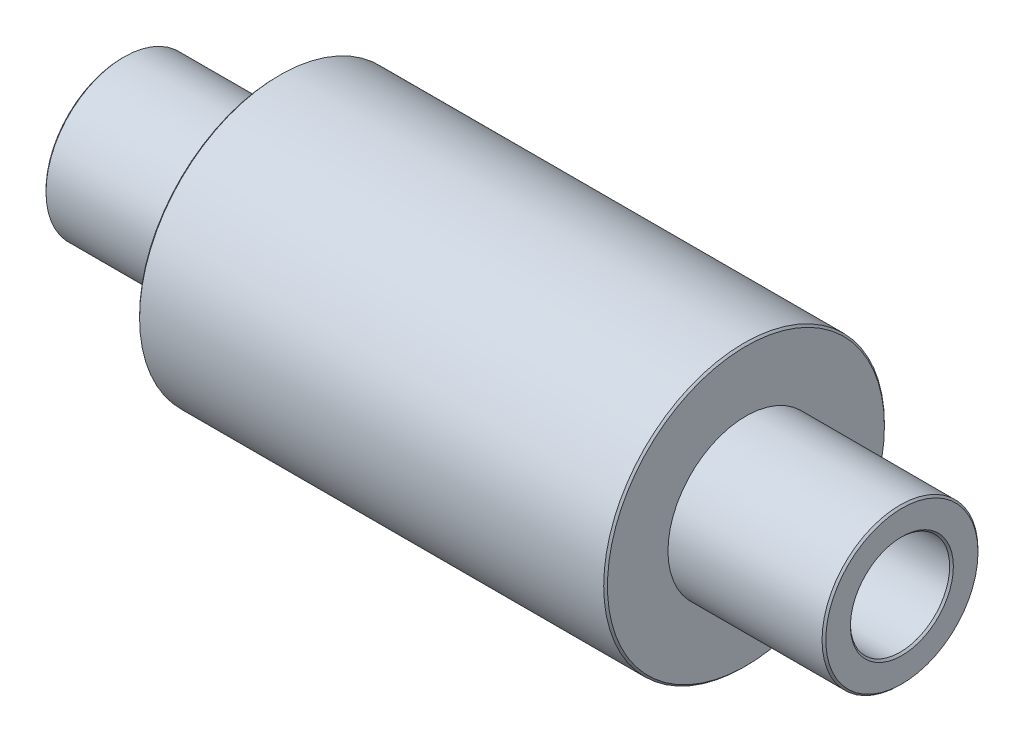
ISO-10303-21;
HEADER;
FILE_DESCRIPTION(('STEP AP214'),'2;1');
FILE_NAME('part.step','',(''),(''),'','','');
FILE_SCHEMA(('AUTOMOTIVE_DESIGN { 1 0 10303 214 1 1 1 1 }'));
ENDSEC;
DATA;
#1=APPLICATION_CONTEXT('core data for automotive mechanical design processes');
#2=APPLICATION_PROTOCOL_DEFINITION('international standard','automotive_design',2000,#1);
#3=PRODUCT_CONTEXT('',#1,'mechanical');
#4=PRODUCT('Part','Part','',(#3));
#5=PRODUCT_RELATED_PRODUCT_CATEGORY('part','',(#4));
#6=PRODUCT_DEFINITION_FORMATION('','',#4);
#7=PRODUCT_DEFINITION_CONTEXT('part definition',#1,'design');
#8=PRODUCT_DEFINITION('design','',#6,#7);
#9=PRODUCT_DEFINITION_SHAPE('','',#8);
#10=(LENGTH_UNIT() NAMED_UNIT(*) SI_UNIT(.MILLI.,.METRE.));
#11=(NAMED_UNIT(*) PLANE_ANGLE_UNIT() SI_UNIT($,.RADIAN.));
#12=(NAMED_UNIT(*) SI_UNIT($,.STERADIAN.) SOLID_ANGLE_UNIT());
#13=UNCERTAINTY_MEASURE_WITH_UNIT(LENGTH_MEASURE(1.E-05),#10,'distance_accuracy_value','');
#14=(GEOMETRIC_REPRESENTATION_CONTEXT(3) GLOBAL_UNCERTAINTY_ASSIGNED_CONTEXT((#13)) GLOBAL_UNIT_ASSIGNED_CONTEXT((#10,
#11,#12)) REPRESENTATION_CONTEXT('',''));
#15=CARTESIAN_POINT('',(0.,0.,0.));
#16=DIRECTION('',(0.,0.,1.));
#17=DIRECTION('',(1.,0.,0.));
#18=AXIS2_PLACEMENT_3D('',#15,#16,#17);
#19=CARTESIAN_POINT('',(15.875,0.,0.));
#20=DIRECTION('',(-1.,0.,0.));
#21=DIRECTION('',(0.,0.,1.));
#22=AXIS2_PLACEMENT_3D('',#19,#20,#21);
#23=CYLINDRICAL_SURFACE('',#22,5.715);
#24=CARTESIAN_POINT('',(-9.44880000000001,0.,0.));
#25=DIRECTION('',(-1.,0.,0.));
#26=DIRECTION('',(0.,0.,1.));
#27=AXIS2_PLACEMENT_3D('',#24,#25,#26);
#28=CIRCLE('',#27,5.715);
#29=CARTESIAN_POINT('',(-9.44880000000001,0.,5.715));
#30=VERTEX_POINT('',#29);
#31=EDGE_CURVE('E64',#30,#30,#28,.F.);
#32=ORIENTED_EDGE('',*,*,#31,.T.);
#33=EDGE_LOOP('',(#32));
#34=FACE_BOUND('',#33,.T.);
#35=CARTESIAN_POINT('',(9.4488,0.,0.));
#36=DIRECTION('',(1.,0.,0.));
#37=DIRECTION('',(0.,0.,-1.));
#38=AXIS2_PLACEMENT_3D('',#35,#36,#37);
#39=CIRCLE('',#38,5.715);
#40=CARTESIAN_POINT('',(9.4488,0.,-5.715));
#41=VERTEX_POINT('',#40);
#42=EDGE_CURVE('E79',#41,#41,#39,.F.);
#43=ORIENTED_EDGE('',*,*,#42,.T.);
#44=EDGE_LOOP('',(#43));
#45=FACE_BOUND('',#44,.T.);
#46=ADVANCED_FACE('F44',(#34,#45),#23,.T.);
#47=CARTESIAN_POINT('',(-15.875,0.,0.));
#48=DIRECTION('',(1.,0.,0.));
#49=DIRECTION('',(0.,0.,-1.));
#50=AXIS2_PLACEMENT_3D('',#47,#48,#49);
#51=PLANE('',#50);
#52=CARTESIAN_POINT('',(-15.875,0.,0.));
#53=DIRECTION('',(1.,0.,0.));
#54=DIRECTION('',(0.,0.,-1.));
#55=AXIS2_PLACEMENT_3D('',#52,#53,#54);
#56=CIRCLE('',#55,2.0955);
#57=CARTESIAN_POINT('',(-15.875,0.,-2.0955));
#58=VERTEX_POINT('',#57);
#59=EDGE_CURVE('E59',#58,#58,#56,.T.);
#60=ORIENTED_EDGE('',*,*,#59,.T.);
#61=EDGE_LOOP('',(#60));
#62=FACE_BOUND('',#61,.T.);
#63=CARTESIAN_POINT('',(-15.875,0.,0.));
#64=DIRECTION('',(1.,0.,0.));
#65=DIRECTION('',(0.,0.,-1.));
#66=AXIS2_PLACEMENT_3D('',#63,#64,#65);
#67=CIRCLE('',#66,3.0988);
#68=CARTESIAN_POINT('',(-15.875,0.,-3.0988));
#69=VERTEX_POINT('',#68);
#70=EDGE_CURVE('E73',#69,#69,#67,.F.);
#71=ORIENTED_EDGE('',*,*,#70,.T.);
#72=EDGE_LOOP('',(#71));
#73=FACE_BOUND('',#72,.T.);
#74=ADVANCED_FACE('F113',(#62,#73),#51,.F.);
#75=CARTESIAN_POINT('',(15.875,0.,0.));
#76=DIRECTION('',(1.,0.,0.));
#77=DIRECTION('',(0.,0.,-1.));
#78=AXIS2_PLACEMENT_3D('',#75,#76,#77);
#79=PLANE('',#78);
#80=CARTESIAN_POINT('',(15.875,0.,0.));
#81=DIRECTION('',(1.,0.,0.));
#82=DIRECTION('',(0.,0.,-1.));
#83=AXIS2_PLACEMENT_3D('',#80,#81,#82);
#84=CIRCLE('',#83,2.09549999999999);
#85=CARTESIAN_POINT('',(15.875,0.,-2.09549999999999));
#86=VERTEX_POINT('',#85);
#87=EDGE_CURVE('E12',#86,#86,#84,.F.);
#88=ORIENTED_EDGE('',*,*,#87,.T.);
#89=EDGE_LOOP('',(#88));
#90=FACE_BOUND('',#89,.T.);
#91=CARTESIAN_POINT('',(15.875,0.,0.));
#92=DIRECTION('',(1.,0.,0.));
#93=DIRECTION('',(0.,0.,-1.));
#94=AXIS2_PLACEMENT_3D('',#91,#92,#93);
#95=CIRCLE('',#94,3.0988);
#96=CARTESIAN_POINT('',(15.875,0.,-3.0988));
#97=VERTEX_POINT('',#96);
#98=EDGE_CURVE('E82',#97,#97,#95,.T.);
#99=ORIENTED_EDGE('',*,*,#98,.T.);
#100=EDGE_LOOP('',(#99));
#101=FACE_BOUND('',#100,.T.);
#102=ADVANCED_FACE('F119',(#90,#101),#79,.T.);
#103=CARTESIAN_POINT('',(15.875,0.,0.));
#104=DIRECTION('',(1.,0.,0.));
#105=DIRECTION('',(0.,0.,-1.));
#106=AXIS2_PLACEMENT_3D('',#103,#104,#105);
#107=CYLINDRICAL_SURFACE('',#106,2.01929999999999);
#108=CARTESIAN_POINT('',(-15.7988,0.,0.));
#109=DIRECTION('',(1.,0.,0.));
#110=DIRECTION('',(0.,0.,-1.));
#111=AXIS2_PLACEMENT_3D('',#108,#109,#110);
#112=CIRCLE('',#111,2.01929999999999);
#113=CARTESIAN_POINT('',(-15.7988,0.,-2.01929999999999));
#114=VERTEX_POINT('',#113);
#115=EDGE_CURVE('E51',#114,#114,#112,.F.);
#116=ORIENTED_EDGE('',*,*,#115,.T.);
#117=EDGE_LOOP('',(#116));
#118=FACE_BOUND('',#117,.T.);
#119=CARTESIAN_POINT('',(15.7988,0.,0.));
#120=DIRECTION('',(1.,0.,0.));
#121=DIRECTION('',(0.,0.,-1.));
#122=AXIS2_PLACEMENT_3D('',#119,#120,#121);
#123=CIRCLE('',#122,2.01929999999999);
#124=CARTESIAN_POINT('',(15.7988,0.,-2.01929999999999));
#125=VERTEX_POINT('',#124);
#126=EDGE_CURVE('E55',#125,#125,#123,.T.);
#127=ORIENTED_EDGE('',*,*,#126,.T.);
#128=EDGE_LOOP('',(#127));
#129=FACE_BOUND('',#128,.T.);
#130=ADVANCED_FACE('F152',(#118,#129),#107,.F.);
#131=CARTESIAN_POINT('',(0.,0.,0.));
#132=DIRECTION('',(-1.,0.,0.));
#133=DIRECTION('',(0.,0.,1.));
#134=AXIS2_PLACEMENT_3D('',#131,#132,#133);
#135=CYLINDRICAL_SURFACE('',#134,3.175);
#136=CARTESIAN_POINT('',(15.7988,0.,0.));
#137=DIRECTION('',(1.,0.,0.));
#138=DIRECTION('',(0.,0.,-1.));
#139=AXIS2_PLACEMENT_3D('',#136,#137,#138);
#140=CIRCLE('',#139,3.175);
#141=CARTESIAN_POINT('',(15.7988,0.,-3.175));
#142=VERTEX_POINT('',#141);
#143=EDGE_CURVE('E85',#142,#142,#140,.F.);
#144=ORIENTED_EDGE('',*,*,#143,.T.);
#145=EDGE_LOOP('',(#144));
#146=FACE_BOUND('',#145,.T.);
#147=CARTESIAN_POINT('',(9.525,0.,0.));
#148=DIRECTION('',(-1.,0.,0.));
#149=DIRECTION('',(0.,0.,1.));
#150=AXIS2_PLACEMENT_3D('',#147,#148,#149);
#151=CIRCLE('',#150,3.175);
#152=CARTESIAN_POINT('',(9.525,0.,3.175));
#153=VERTEX_POINT('',#152);
#154=EDGE_CURVE('E88',#153,#153,#151,.T.);
#155=ORIENTED_EDGE('',*,*,#154,.F.);
#156=EDGE_LOOP('',(#155));
#157=FACE_BOUND('',#156,.T.);
#158=ADVANCED_FACE('F154',(#146,#157),#135,.T.);
#159=CARTESIAN_POINT('',(9.525,5.715,0.));
#160=DIRECTION('',(1.,0.,0.));
#161=DIRECTION('',(0.,0.,-1.));
#162=AXIS2_PLACEMENT_3D('',#159,#160,#161);
#163=PLANE('',#162);
#164=CARTESIAN_POINT('',(9.525,0.,0.));
#165=DIRECTION('',(1.,0.,0.));
#166=DIRECTION('',(0.,0.,-1.));
#167=AXIS2_PLACEMENT_3D('',#164,#165,#166);
#168=CIRCLE('',#167,5.6388);
#169=CARTESIAN_POINT('',(9.525,0.,-5.6388));
#170=VERTEX_POINT('',#169);
#171=EDGE_CURVE('E76',#170,#170,#168,.T.);
#172=ORIENTED_EDGE('',*,*,#171,.T.);
#173=EDGE_LOOP('',(#172));
#174=FACE_BOUND('',#173,.T.);
#175=ORIENTED_EDGE('',*,*,#154,.T.);
#176=EDGE_LOOP('',(#175));
#177=FACE_BOUND('',#176,.T.);
#178=ADVANCED_FACE('F128',(#174,#177),#163,.T.);
#179=CARTESIAN_POINT('',(15.7988,0.,0.));
#180=DIRECTION('',(-1.,0.,0.));
#181=DIRECTION('',(0.,0.,1.));
#182=AXIS2_PLACEMENT_3D('',#179,#180,#181);
#183=CONICAL_SURFACE('',#182,3.175,0.785398163397443);
#184=ORIENTED_EDGE('',*,*,#98,.F.);
#185=EDGE_LOOP('',(#184));
#186=FACE_BOUND('',#185,.T.);
#187=ORIENTED_EDGE('',*,*,#143,.F.);
#188=EDGE_LOOP('',(#187));
#189=FACE_BOUND('',#188,.T.);
#190=ADVANCED_FACE('F125',(#186,#189),#183,.T.);
#191=CARTESIAN_POINT('',(9.4488,0.,0.));
#192=DIRECTION('',(-1.,0.,0.));
#193=DIRECTION('',(0.,0.,1.));
#194=AXIS2_PLACEMENT_3D('',#191,#192,#193);
#195=CONICAL_SURFACE('',#194,5.715,0.785398163397465);
#196=ORIENTED_EDGE('',*,*,#171,.F.);
#197=EDGE_LOOP('',(#196));
#198=FACE_BOUND('',#197,.T.);
#199=ORIENTED_EDGE('',*,*,#42,.F.);
#200=EDGE_LOOP('',(#199));
#201=FACE_BOUND('',#200,.T.);
#202=ADVANCED_FACE('F109',(#198,#201),#195,.T.);
#203=CARTESIAN_POINT('',(0.,0.,0.));
#204=DIRECTION('',(1.,0.,0.));
#205=DIRECTION('',(0.,0.,1.));
#206=AXIS2_PLACEMENT_3D('',#203,#204,#205);
#207=CYLINDRICAL_SURFACE('',#206,3.175);
#208=CARTESIAN_POINT('',(-15.7988,0.,0.));
#209=DIRECTION('',(1.,0.,0.));
#210=DIRECTION('',(0.,0.,-1.));
#211=AXIS2_PLACEMENT_3D('',#208,#209,#210);
#212=CIRCLE('',#211,3.175);
#213=CARTESIAN_POINT('',(-15.7988,0.,-3.175));
#214=VERTEX_POINT('',#213);
#215=EDGE_CURVE('E70',#214,#214,#212,.T.);
#216=ORIENTED_EDGE('',*,*,#215,.T.);
#217=EDGE_LOOP('',(#216));
#218=FACE_BOUND('',#217,.T.);
#219=CARTESIAN_POINT('',(-9.525,0.,0.));
#220=DIRECTION('',(-1.,0.,0.));
#221=DIRECTION('',(0.,0.,1.));
#222=AXIS2_PLACEMENT_3D('',#219,#220,#221);
#223=CIRCLE('',#222,3.175);
#224=CARTESIAN_POINT('',(-9.525,0.,3.175));
#225=VERTEX_POINT('',#224);
#226=EDGE_CURVE('E91',#225,#225,#223,.T.);
#227=ORIENTED_EDGE('',*,*,#226,.T.);
#228=EDGE_LOOP('',(#227));
#229=FACE_BOUND('',#228,.T.);
#230=ADVANCED_FACE('F95',(#218,#229),#207,.T.);
#231=CARTESIAN_POINT('',(-9.525,5.715,0.));
#232=DIRECTION('',(-1.,0.,0.));
#233=DIRECTION('',(0.,0.,-1.));
#234=AXIS2_PLACEMENT_3D('',#231,#232,#233);
#235=PLANE('',#234);
#236=CARTESIAN_POINT('',(-9.525,0.,0.));
#237=DIRECTION('',(-1.,0.,0.));
#238=DIRECTION('',(0.,0.,1.));
#239=AXIS2_PLACEMENT_3D('',#236,#237,#238);
#240=CIRCLE('',#239,5.6388);
#241=CARTESIAN_POINT('',(-9.525,0.,5.6388));
#242=VERTEX_POINT('',#241);
#243=EDGE_CURVE('E67',#242,#242,#240,.T.);
#244=ORIENTED_EDGE('',*,*,#243,.T.);
#245=EDGE_LOOP('',(#244));
#246=FACE_BOUND('',#245,.T.);
#247=ORIENTED_EDGE('',*,*,#226,.F.);
#248=EDGE_LOOP('',(#247));
#249=FACE_BOUND('',#248,.T.);
#250=ADVANCED_FACE('F97',(#246,#249),#235,.T.);
#251=CARTESIAN_POINT('',(-15.875,0.,0.));
#252=DIRECTION('',(1.,0.,0.));
#253=DIRECTION('',(0.,0.,-1.));
#254=AXIS2_PLACEMENT_3D('',#251,#252,#253);
#255=CONICAL_SURFACE('',#254,3.0988,0.785398163397417);
#256=ORIENTED_EDGE('',*,*,#215,.F.);
#257=EDGE_LOOP('',(#256));
#258=FACE_BOUND('',#257,.T.);
#259=ORIENTED_EDGE('',*,*,#70,.F.);
#260=EDGE_LOOP('',(#259));
#261=FACE_BOUND('',#260,.T.);
#262=ADVANCED_FACE('F99',(#258,#261),#255,.T.);
#263=CARTESIAN_POINT('',(-9.525,0.,0.));
#264=DIRECTION('',(1.,0.,0.));
#265=DIRECTION('',(0.,0.,-1.));
#266=AXIS2_PLACEMENT_3D('',#263,#264,#265);
#267=CONICAL_SURFACE('',#266,5.6388,0.785398163397488);
#268=ORIENTED_EDGE('',*,*,#31,.F.);
#269=EDGE_LOOP('',(#268));
#270=FACE_BOUND('',#269,.T.);
#271=ORIENTED_EDGE('',*,*,#243,.F.);
#272=EDGE_LOOP('',(#271));
#273=FACE_BOUND('',#272,.T.);
#274=ADVANCED_FACE('F106',(#270,#273),#267,.T.);
#275=CARTESIAN_POINT('',(-15.875,0.,0.));
#276=DIRECTION('',(-1.,0.,0.));
#277=DIRECTION('',(0.,0.,1.));
#278=AXIS2_PLACEMENT_3D('',#275,#276,#277);
#279=CONICAL_SURFACE('',#278,2.0955,0.78539816339742);
#280=ORIENTED_EDGE('',*,*,#115,.F.);
#281=EDGE_LOOP('',(#280));
#282=FACE_BOUND('',#281,.T.);
#283=ORIENTED_EDGE('',*,*,#59,.F.);
#284=EDGE_LOOP('',(#283));
#285=FACE_BOUND('',#284,.T.);
#286=ADVANCED_FACE('F134',(#282,#285),#279,.F.);
#287=CARTESIAN_POINT('',(15.7988,0.,0.));
#288=DIRECTION('',(1.,0.,0.));
#289=DIRECTION('',(0.,0.,-1.));
#290=AXIS2_PLACEMENT_3D('',#287,#288,#289);
#291=CONICAL_SURFACE('',#290,2.01929999999999,0.78539816339742);
#292=ORIENTED_EDGE('',*,*,#87,.F.);
#293=EDGE_LOOP('',(#292));
#294=FACE_BOUND('',#293,.T.);
#295=ORIENTED_EDGE('',*,*,#126,.F.);
#296=EDGE_LOOP('',(#295));
#297=FACE_BOUND('',#296,.T.);
#298=ADVANCED_FACE('F46',(#294,#297),#291,.F.);
#299=CLOSED_SHELL('',(#46,#74,#102,#130,#158,#178,#190,#202,#230,#250,#262,#274,#286,#298));
#300=MANIFOLD_SOLID_BREP('B2',#299);
#301=ADVANCED_BREP_SHAPE_REPRESENTATION('',(#18,#300),#14);
#302=SHAPE_DEFINITION_REPRESENTATION(#9,#301);
ENDSEC;
END-ISO-10303-21;
